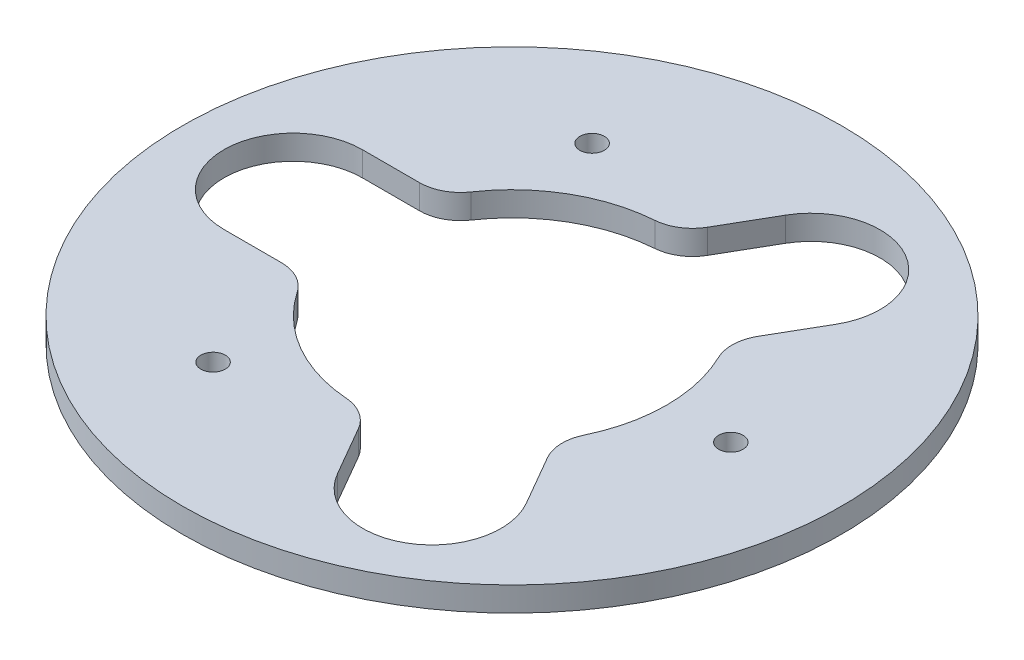
ISO-10303-21;
HEADER;
FILE_DESCRIPTION(('STEP AP214'),'2;1');
FILE_NAME('part.step','',(''),(''),'','','');
FILE_SCHEMA(('AUTOMOTIVE_DESIGN { 1 0 10303 214 1 1 1 1 }'));
ENDSEC;
DATA;
#1=APPLICATION_CONTEXT('core data for automotive mechanical design processes');
#2=APPLICATION_PROTOCOL_DEFINITION('international standard','automotive_design',2000,#1);
#3=PRODUCT_CONTEXT('',#1,'mechanical');
#4=PRODUCT('Part','Part','',(#3));
#5=PRODUCT_RELATED_PRODUCT_CATEGORY('part','',(#4));
#6=PRODUCT_DEFINITION_FORMATION('','',#4);
#7=PRODUCT_DEFINITION_CONTEXT('part definition',#1,'design');
#8=PRODUCT_DEFINITION('design','',#6,#7);
#9=PRODUCT_DEFINITION_SHAPE('','',#8);
#10=(LENGTH_UNIT() NAMED_UNIT(*) SI_UNIT(.MILLI.,.METRE.));
#11=(NAMED_UNIT(*) PLANE_ANGLE_UNIT() SI_UNIT($,.RADIAN.));
#12=(NAMED_UNIT(*) SI_UNIT($,.STERADIAN.) SOLID_ANGLE_UNIT());
#13=UNCERTAINTY_MEASURE_WITH_UNIT(LENGTH_MEASURE(1.E-05),#10,'distance_accuracy_value','');
#14=(GEOMETRIC_REPRESENTATION_CONTEXT(3) GLOBAL_UNCERTAINTY_ASSIGNED_CONTEXT((#13)) GLOBAL_UNIT_ASSIGNED_CONTEXT((#10,
#11,#12)) REPRESENTATION_CONTEXT('',''));
#15=CARTESIAN_POINT('',(0.,0.,0.));
#16=DIRECTION('',(0.,0.,1.));
#17=DIRECTION('',(1.,0.,0.));
#18=AXIS2_PLACEMENT_3D('',#15,#16,#17);
#19=CARTESIAN_POINT('',(0.,-3.,0.));
#20=DIRECTION('',(0.,1.,0.));
#21=DIRECTION('',(0.,0.,1.));
#22=AXIS2_PLACEMENT_3D('',#19,#20,#21);
#23=CYLINDRICAL_SURFACE('',#22,40.5);
#24=CARTESIAN_POINT('',(0.,-3.,0.));
#25=DIRECTION('',(0.,1.,0.));
#26=DIRECTION('',(0.,0.,1.));
#27=AXIS2_PLACEMENT_3D('',#24,#25,#26);
#28=CIRCLE('',#27,40.5);
#29=CARTESIAN_POINT('',(0.,-3.,40.5));
#30=VERTEX_POINT('',#29);
#31=EDGE_CURVE('E11',#30,#30,#28,.T.);
#32=ORIENTED_EDGE('',*,*,#31,.T.);
#33=EDGE_LOOP('',(#32));
#34=FACE_BOUND('',#33,.T.);
#35=CARTESIAN_POINT('',(0.,0.,0.));
#36=DIRECTION('',(0.,1.,0.));
#37=DIRECTION('',(0.,0.,1.));
#38=AXIS2_PLACEMENT_3D('',#35,#36,#37);
#39=CIRCLE('',#38,40.5);
#40=CARTESIAN_POINT('',(0.,0.,40.5));
#41=VERTEX_POINT('',#40);
#42=EDGE_CURVE('E50',#41,#41,#39,.T.);
#43=ORIENTED_EDGE('',*,*,#42,.F.);
#44=EDGE_LOOP('',(#43));
#45=FACE_BOUND('',#44,.T.);
#46=ADVANCED_FACE('F47',(#34,#45),#23,.T.);
#47=CARTESIAN_POINT('',(0.,-3.,0.));
#48=DIRECTION('',(0.,1.,0.));
#49=DIRECTION('',(0.,0.,1.));
#50=AXIS2_PLACEMENT_3D('',#47,#48,#49);
#51=PLANE('',#50);
#52=CARTESIAN_POINT('',(-13.4470587469807,-3.,23.2909888821045));
#53=DIRECTION('',(0.,1.,0.));
#54=DIRECTION('',(0.,0.,1.));
#55=AXIS2_PLACEMENT_3D('',#52,#53,#54);
#56=CIRCLE('',#55,1.5);
#57=CARTESIAN_POINT('',(-13.4470587469807,-3.,24.7909888821045));
#58=VERTEX_POINT('',#57);
#59=EDGE_CURVE('E618',#58,#58,#56,.T.);
#60=ORIENTED_EDGE('',*,*,#59,.T.);
#61=EDGE_LOOP('',(#60));
#62=FACE_BOUND('',#61,.T.);
#63=CARTESIAN_POINT('',(26.8941174246538,-3.,4.00146010076652E-08));
#64=DIRECTION('',(0.,1.,0.));
#65=DIRECTION('',(0.,0.,1.));
#66=AXIS2_PLACEMENT_3D('',#63,#64,#65);
#67=CIRCLE('',#66,1.5);
#68=CARTESIAN_POINT('',(26.8941174246538,-3.,1.5000000400146));
#69=VERTEX_POINT('',#68);
#70=EDGE_CURVE('E625',#69,#69,#67,.T.);
#71=ORIENTED_EDGE('',*,*,#70,.T.);
#72=EDGE_LOOP('',(#71));
#73=FACE_BOUND('',#72,.T.);
#74=CARTESIAN_POINT('',(-13.4470586776733,-3.,-23.2909889221191));
#75=DIRECTION('',(0.,1.,0.));
#76=DIRECTION('',(0.,0.,1.));
#77=AXIS2_PLACEMENT_3D('',#74,#75,#76);
#78=CIRCLE('',#77,1.5);
#79=CARTESIAN_POINT('',(-13.4470586776733,-3.,-21.7909889221191));
#80=VERTEX_POINT('',#79);
#81=EDGE_CURVE('E244',#80,#80,#78,.T.);
#82=ORIENTED_EDGE('',*,*,#81,.T.);
#83=EDGE_LOOP('',(#82));
#84=FACE_BOUND('',#83,.T.);
#85=DIRECTION('',(1.,0.,0.));
#86=VECTOR('',#85,1.);
#87=CARTESIAN_POINT('',(-26.8941192626953,-3.,8.5));
#88=LINE('',#87,#86);
#89=CARTESIAN_POINT('',(-26.8941192626953,-3.,8.5));
#90=VERTEX_POINT('',#89);
#91=CARTESIAN_POINT('',(-19.8431348329844,-3.,8.5));
#92=VERTEX_POINT('',#91);
#93=EDGE_CURVE('E179',#90,#92,#88,.T.);
#94=ORIENTED_EDGE('',*,*,#93,.T.);
#95=CARTESIAN_POINT('',(-19.8431348329844,-3.,13.5));
#96=DIRECTION('',(0.,-1.,0.));
#97=DIRECTION('',(0.,0.,-1.));
#98=AXIS2_PLACEMENT_3D('',#95,#96,#97);
#99=CIRCLE('',#98,5.);
#100=CARTESIAN_POINT('',(-15.7091484094462,-3.,10.6875000000001));
#101=VERTEX_POINT('',#100);
#102=EDGE_CURVE('E173',#92,#101,#99,.T.);
#103=ORIENTED_EDGE('',*,*,#102,.T.);
#104=CARTESIAN_POINT('',(0.,-3.,0.));
#105=DIRECTION('',(0.,1.,0.));
#106=DIRECTION('',(0.,0.,1.));
#107=AXIS2_PLACEMENT_3D('',#104,#105,#106);
#108=CIRCLE('',#107,19.0000000000002);
#109=CARTESIAN_POINT('',(-1.40107229822298,-3.,18.9482715944004));
#110=VERTEX_POINT('',#109);
#111=EDGE_CURVE('E182',#101,#110,#108,.T.);
#112=ORIENTED_EDGE('',*,*,#111,.T.);
#113=CARTESIAN_POINT('',(-1.76977553459748,-3.,23.9346588560848));
#114=DIRECTION('',(0.,-1.,0.));
#115=DIRECTION('',(0.,0.,1.));
#116=AXIS2_PLACEMENT_3D('',#113,#114,#115);
#117=CIRCLE('',#116,5.00000000000001);
#118=CARTESIAN_POINT('',(2.56035148432473,-3.,21.4346588560848));
#119=VERTEX_POINT('',#118);
#120=EDGE_CURVE('E61',#110,#119,#117,.T.);
#121=ORIENTED_EDGE('',*,*,#120,.T.);
#122=DIRECTION('',(0.5,0.,0.866025403784438));
#123=VECTOR('',#122,1.);
#124=CARTESIAN_POINT('',(6.08584369917995,-3.,27.5409904939026));
#125=LINE('',#124,#123);
#126=CARTESIAN_POINT('',(6.08584369917993,-3.,27.5409904939026));
#127=VERTEX_POINT('',#126);
#128=EDGE_CURVE('E200',#119,#127,#125,.T.);
#129=ORIENTED_EDGE('',*,*,#128,.T.);
#130=CARTESIAN_POINT('',(13.4470596313477,-3.,23.2909904939026));
#131=DIRECTION('',(0.,1.,0.));
#132=DIRECTION('',(0.,0.,1.));
#133=AXIS2_PLACEMENT_3D('',#130,#131,#132);
#134=CIRCLE('',#133,8.5);
#135=CARTESIAN_POINT('',(20.8082755635154,-3.,19.0409904939025));
#136=VERTEX_POINT('',#135);
#137=EDGE_CURVE('E203',#127,#136,#134,.T.);
#138=ORIENTED_EDGE('',*,*,#137,.T.);
#139=DIRECTION('',(-0.5,0.,-0.866025403784438));
#140=VECTOR('',#139,1.);
#141=CARTESIAN_POINT('',(20.8082755635154,-3.,19.0409904939025));
#142=LINE('',#141,#140);
#143=CARTESIAN_POINT('',(17.2827833486602,-3.,12.9346588560848));
#144=VERTEX_POINT('',#143);
#145=EDGE_CURVE('E206',#136,#144,#142,.T.);
#146=ORIENTED_EDGE('',*,*,#145,.T.);
#147=CARTESIAN_POINT('',(21.6129103675824,-3.,10.4346588560848));
#148=DIRECTION('',(0.,-1.,0.));
#149=DIRECTION('',(0.,0.,-1.));
#150=AXIS2_PLACEMENT_3D('',#147,#148,#149);
#151=CIRCLE('',#150,4.99999999999999);
#152=CARTESIAN_POINT('',(17.1102207076695,-3.,8.2607715944005));
#153=VERTEX_POINT('',#152);
#154=EDGE_CURVE('E209',#144,#153,#151,.T.);
#155=ORIENTED_EDGE('',*,*,#154,.T.);
#156=CARTESIAN_POINT('',(0.,-3.,0.));
#157=DIRECTION('',(0.,1.,0.));
#158=DIRECTION('',(0.,0.,1.));
#159=AXIS2_PLACEMENT_3D('',#156,#157,#158);
#160=CIRCLE('',#159,19.0000000000004);
#161=CARTESIAN_POINT('',(17.1102207076694,-3.,-8.26077159440052));
#162=VERTEX_POINT('',#161);
#163=EDGE_CURVE('E212',#153,#162,#160,.T.);
#164=ORIENTED_EDGE('',*,*,#163,.T.);
#165=CARTESIAN_POINT('',(21.6129103675824,-3.,-10.4346588560848));
#166=DIRECTION('',(0.,-1.,0.));
#167=DIRECTION('',(0.,0.,1.));
#168=AXIS2_PLACEMENT_3D('',#165,#166,#167);
#169=CIRCLE('',#168,5.);
#170=CARTESIAN_POINT('',(17.2827833486602,-3.,-12.9346588560848));
#171=VERTEX_POINT('',#170);
#172=EDGE_CURVE('E215',#162,#171,#169,.T.);
#173=ORIENTED_EDGE('',*,*,#172,.T.);
#174=DIRECTION('',(0.5,0.,-0.866025403784439));
#175=VECTOR('',#174,1.);
#176=CARTESIAN_POINT('',(20.8082755635154,-3.,-19.0409904939026));
#177=LINE('',#176,#175);
#178=CARTESIAN_POINT('',(20.8082755635154,-3.,-19.0409904939026));
#179=VERTEX_POINT('',#178);
#180=EDGE_CURVE('E218',#171,#179,#177,.T.);
#181=ORIENTED_EDGE('',*,*,#180,.T.);
#182=CARTESIAN_POINT('',(13.4470596313477,-3.,-23.2909904939026));
#183=DIRECTION('',(0.,1.,0.));
#184=DIRECTION('',(0.,0.,1.));
#185=AXIS2_PLACEMENT_3D('',#182,#183,#184);
#186=CIRCLE('',#185,8.5);
#187=CARTESIAN_POINT('',(6.08584369917992,-3.,-27.5409904939026));
#188=VERTEX_POINT('',#187);
#189=EDGE_CURVE('E221',#179,#188,#186,.T.);
#190=ORIENTED_EDGE('',*,*,#189,.T.);
#191=DIRECTION('',(-0.5,0.,0.866025403784439));
#192=VECTOR('',#191,1.);
#193=CARTESIAN_POINT('',(6.08584369917992,-3.,-27.5409904939026));
#194=LINE('',#193,#192);
#195=CARTESIAN_POINT('',(2.56035148432472,-3.,-21.4346588560848));
#196=VERTEX_POINT('',#195);
#197=EDGE_CURVE('E224',#188,#196,#194,.T.);
#198=ORIENTED_EDGE('',*,*,#197,.T.);
#199=CARTESIAN_POINT('',(-1.76977553459748,-3.,-23.9346588560848));
#200=DIRECTION('',(0.,-1.,0.));
#201=DIRECTION('',(0.,0.,-1.));
#202=AXIS2_PLACEMENT_3D('',#199,#200,#201);
#203=CIRCLE('',#202,5.);
#204=CARTESIAN_POINT('',(-1.40107229822299,-3.,-18.9482715944004));
#205=VERTEX_POINT('',#204);
#206=EDGE_CURVE('E227',#196,#205,#203,.T.);
#207=ORIENTED_EDGE('',*,*,#206,.T.);
#208=CARTESIAN_POINT('',(0.,-3.,0.));
#209=DIRECTION('',(0.,1.,0.));
#210=DIRECTION('',(0.,0.,1.));
#211=AXIS2_PLACEMENT_3D('',#208,#209,#210);
#212=CIRCLE('',#211,19.0000000000002);
#213=CARTESIAN_POINT('',(-15.709148409446,-3.,-10.6875));
#214=VERTEX_POINT('',#213);
#215=EDGE_CURVE('E230',#205,#214,#212,.T.);
#216=ORIENTED_EDGE('',*,*,#215,.T.);
#217=CARTESIAN_POINT('',(-19.8431348329844,-3.,-13.5));
#218=DIRECTION('',(0.,-1.,0.));
#219=DIRECTION('',(0.,0.,1.));
#220=AXIS2_PLACEMENT_3D('',#217,#218,#219);
#221=CIRCLE('',#220,5.);
#222=CARTESIAN_POINT('',(-19.8431348329844,-3.,-8.5));
#223=VERTEX_POINT('',#222);
#224=EDGE_CURVE('E233',#214,#223,#221,.T.);
#225=ORIENTED_EDGE('',*,*,#224,.T.);
#226=DIRECTION('',(-1.,0.,0.));
#227=VECTOR('',#226,1.);
#228=CARTESIAN_POINT('',(-26.8941192626953,-3.,-8.5));
#229=LINE('',#228,#227);
#230=CARTESIAN_POINT('',(-26.8941192626953,-3.,-8.5));
#231=VERTEX_POINT('',#230);
#232=EDGE_CURVE('E236',#223,#231,#229,.T.);
#233=ORIENTED_EDGE('',*,*,#232,.T.);
#234=CARTESIAN_POINT('',(-26.8941192626953,-3.,0.));
#235=DIRECTION('',(0.,1.,0.));
#236=DIRECTION('',(0.,0.,1.));
#237=AXIS2_PLACEMENT_3D('',#234,#235,#236);
#238=CIRCLE('',#237,8.5);
#239=EDGE_CURVE('E239',#231,#90,#238,.T.);
#240=ORIENTED_EDGE('',*,*,#239,.T.);
#241=EDGE_LOOP('',(#94,#103,#112,#121,#129,#138,#146,#155,#164,#173,#181,#190,#198,#207,#216,
#225,#233,#240));
#242=FACE_BOUND('',#241,.T.);
#243=ORIENTED_EDGE('',*,*,#31,.F.);
#244=EDGE_LOOP('',(#243));
#245=FACE_BOUND('',#244,.T.);
#246=ADVANCED_FACE('F186',(#62,#73,#84,#242,#245),#51,.F.);
#247=CARTESIAN_POINT('',(0.,0.,0.));
#248=DIRECTION('',(0.,1.,0.));
#249=DIRECTION('',(0.,0.,1.));
#250=AXIS2_PLACEMENT_3D('',#247,#248,#249);
#251=PLANE('',#250);
#252=CARTESIAN_POINT('',(-13.4470587469807,0.,23.2909888821045));
#253=DIRECTION('',(0.,1.,0.));
#254=DIRECTION('',(0.,0.,1.));
#255=AXIS2_PLACEMENT_3D('',#252,#253,#254);
#256=CIRCLE('',#255,1.5);
#257=CARTESIAN_POINT('',(-13.4470587469807,0.,24.7909888821045));
#258=VERTEX_POINT('',#257);
#259=EDGE_CURVE('E620',#258,#258,#256,.T.);
#260=ORIENTED_EDGE('',*,*,#259,.F.);
#261=EDGE_LOOP('',(#260));
#262=FACE_BOUND('',#261,.T.);
#263=CARTESIAN_POINT('',(26.8941174246538,0.,4.00146010076652E-08));
#264=DIRECTION('',(0.,1.,0.));
#265=DIRECTION('',(0.,0.,1.));
#266=AXIS2_PLACEMENT_3D('',#263,#264,#265);
#267=CIRCLE('',#266,1.5);
#268=CARTESIAN_POINT('',(26.8941174246538,0.,1.5000000400146));
#269=VERTEX_POINT('',#268);
#270=EDGE_CURVE('E622',#269,#269,#267,.T.);
#271=ORIENTED_EDGE('',*,*,#270,.F.);
#272=EDGE_LOOP('',(#271));
#273=FACE_BOUND('',#272,.T.);
#274=CARTESIAN_POINT('',(-13.4470586776733,0.,-23.2909889221191));
#275=DIRECTION('',(0.,1.,0.));
#276=DIRECTION('',(0.,0.,1.));
#277=AXIS2_PLACEMENT_3D('',#274,#275,#276);
#278=CIRCLE('',#277,1.5);
#279=CARTESIAN_POINT('',(-13.4470586776733,0.,-21.7909889221191));
#280=VERTEX_POINT('',#279);
#281=EDGE_CURVE('E196',#280,#280,#278,.T.);
#282=ORIENTED_EDGE('',*,*,#281,.F.);
#283=EDGE_LOOP('',(#282));
#284=FACE_BOUND('',#283,.T.);
#285=CARTESIAN_POINT('',(-19.8431348329844,0.,13.5));
#286=DIRECTION('',(0.,-1.,0.));
#287=DIRECTION('',(0.,0.,-1.));
#288=AXIS2_PLACEMENT_3D('',#285,#286,#287);
#289=CIRCLE('',#288,5.);
#290=CARTESIAN_POINT('',(-19.8431348329844,0.,8.5));
#291=VERTEX_POINT('',#290);
#292=CARTESIAN_POINT('',(-15.7091484094462,0.,10.6875000000001));
#293=VERTEX_POINT('',#292);
#294=EDGE_CURVE('E69',#291,#293,#289,.T.);
#295=ORIENTED_EDGE('',*,*,#294,.F.);
#296=DIRECTION('',(1.,0.,0.));
#297=VECTOR('',#296,1.);
#298=CARTESIAN_POINT('',(-26.8941192626953,0.,8.5));
#299=LINE('',#298,#297);
#300=CARTESIAN_POINT('',(-26.8941192626953,0.,8.5));
#301=VERTEX_POINT('',#300);
#302=EDGE_CURVE('E190',#301,#291,#299,.T.);
#303=ORIENTED_EDGE('',*,*,#302,.F.);
#304=CARTESIAN_POINT('',(-26.8941192626953,0.,0.));
#305=DIRECTION('',(0.,1.,0.));
#306=DIRECTION('',(0.,0.,1.));
#307=AXIS2_PLACEMENT_3D('',#304,#305,#306);
#308=CIRCLE('',#307,8.5);
#309=CARTESIAN_POINT('',(-26.8941192626953,0.,-8.5));
#310=VERTEX_POINT('',#309);
#311=EDGE_CURVE('E193',#310,#301,#308,.T.);
#312=ORIENTED_EDGE('',*,*,#311,.F.);
#313=DIRECTION('',(-1.,0.,0.));
#314=VECTOR('',#313,1.);
#315=CARTESIAN_POINT('',(-26.8941192626953,0.,-8.5));
#316=LINE('',#315,#314);
#317=CARTESIAN_POINT('',(-19.8431348329844,0.,-8.5));
#318=VERTEX_POINT('',#317);
#319=EDGE_CURVE('E285',#318,#310,#316,.T.);
#320=ORIENTED_EDGE('',*,*,#319,.F.);
#321=CARTESIAN_POINT('',(-19.8431348329844,0.,-13.5));
#322=DIRECTION('',(0.,-1.,0.));
#323=DIRECTION('',(0.,0.,1.));
#324=AXIS2_PLACEMENT_3D('',#321,#322,#323);
#325=CIRCLE('',#324,5.);
#326=CARTESIAN_POINT('',(-15.709148409446,0.,-10.6875));
#327=VERTEX_POINT('',#326);
#328=EDGE_CURVE('E282',#327,#318,#325,.T.);
#329=ORIENTED_EDGE('',*,*,#328,.F.);
#330=CARTESIAN_POINT('',(0.,0.,0.));
#331=DIRECTION('',(0.,1.,0.));
#332=DIRECTION('',(0.,0.,1.));
#333=AXIS2_PLACEMENT_3D('',#330,#331,#332);
#334=CIRCLE('',#333,19.0000000000002);
#335=CARTESIAN_POINT('',(-1.40107229822299,0.,-18.9482715944004));
#336=VERTEX_POINT('',#335);
#337=EDGE_CURVE('E279',#336,#327,#334,.T.);
#338=ORIENTED_EDGE('',*,*,#337,.F.);
#339=CARTESIAN_POINT('',(-1.76977553459748,0.,-23.9346588560848));
#340=DIRECTION('',(0.,-1.,0.));
#341=DIRECTION('',(0.,0.,-1.));
#342=AXIS2_PLACEMENT_3D('',#339,#340,#341);
#343=CIRCLE('',#342,5.);
#344=CARTESIAN_POINT('',(2.56035148432472,0.,-21.4346588560848));
#345=VERTEX_POINT('',#344);
#346=EDGE_CURVE('E276',#345,#336,#343,.T.);
#347=ORIENTED_EDGE('',*,*,#346,.F.);
#348=DIRECTION('',(-0.5,0.,0.866025403784439));
#349=VECTOR('',#348,1.);
#350=CARTESIAN_POINT('',(6.08584369917992,0.,-27.5409904939026));
#351=LINE('',#350,#349);
#352=CARTESIAN_POINT('',(6.08584369917992,0.,-27.5409904939026));
#353=VERTEX_POINT('',#352);
#354=EDGE_CURVE('E273',#353,#345,#351,.T.);
#355=ORIENTED_EDGE('',*,*,#354,.F.);
#356=CARTESIAN_POINT('',(13.4470596313477,0.,-23.2909904939026));
#357=DIRECTION('',(0.,1.,0.));
#358=DIRECTION('',(0.,0.,1.));
#359=AXIS2_PLACEMENT_3D('',#356,#357,#358);
#360=CIRCLE('',#359,8.5);
#361=CARTESIAN_POINT('',(20.8082755635154,0.,-19.0409904939026));
#362=VERTEX_POINT('',#361);
#363=EDGE_CURVE('E270',#362,#353,#360,.T.);
#364=ORIENTED_EDGE('',*,*,#363,.F.);
#365=DIRECTION('',(0.5,0.,-0.866025403784439));
#366=VECTOR('',#365,1.);
#367=CARTESIAN_POINT('',(20.8082755635154,0.,-19.0409904939026));
#368=LINE('',#367,#366);
#369=CARTESIAN_POINT('',(17.2827833486602,0.,-12.9346588560848));
#370=VERTEX_POINT('',#369);
#371=EDGE_CURVE('E267',#370,#362,#368,.T.);
#372=ORIENTED_EDGE('',*,*,#371,.F.);
#373=CARTESIAN_POINT('',(21.6129103675824,0.,-10.4346588560848));
#374=DIRECTION('',(0.,-1.,0.));
#375=DIRECTION('',(0.,0.,1.));
#376=AXIS2_PLACEMENT_3D('',#373,#374,#375);
#377=CIRCLE('',#376,5.);
#378=CARTESIAN_POINT('',(17.1102207076694,0.,-8.26077159440052));
#379=VERTEX_POINT('',#378);
#380=EDGE_CURVE('E264',#379,#370,#377,.T.);
#381=ORIENTED_EDGE('',*,*,#380,.F.);
#382=CARTESIAN_POINT('',(0.,0.,0.));
#383=DIRECTION('',(0.,1.,0.));
#384=DIRECTION('',(0.,0.,1.));
#385=AXIS2_PLACEMENT_3D('',#382,#383,#384);
#386=CIRCLE('',#385,19.0000000000004);
#387=CARTESIAN_POINT('',(17.1102207076695,0.,8.2607715944005));
#388=VERTEX_POINT('',#387);
#389=EDGE_CURVE('E261',#388,#379,#386,.T.);
#390=ORIENTED_EDGE('',*,*,#389,.F.);
#391=CARTESIAN_POINT('',(21.6129103675824,0.,10.4346588560848));
#392=DIRECTION('',(0.,-1.,0.));
#393=DIRECTION('',(0.,0.,-1.));
#394=AXIS2_PLACEMENT_3D('',#391,#392,#393);
#395=CIRCLE('',#394,4.99999999999999);
#396=CARTESIAN_POINT('',(17.2827833486602,0.,12.9346588560848));
#397=VERTEX_POINT('',#396);
#398=EDGE_CURVE('E258',#397,#388,#395,.T.);
#399=ORIENTED_EDGE('',*,*,#398,.F.);
#400=DIRECTION('',(-0.5,0.,-0.866025403784438));
#401=VECTOR('',#400,1.);
#402=CARTESIAN_POINT('',(20.8082755635154,0.,19.0409904939025));
#403=LINE('',#402,#401);
#404=CARTESIAN_POINT('',(20.8082755635154,0.,19.0409904939025));
#405=VERTEX_POINT('',#404);
#406=EDGE_CURVE('E255',#405,#397,#403,.T.);
#407=ORIENTED_EDGE('',*,*,#406,.F.);
#408=CARTESIAN_POINT('',(13.4470596313477,0.,23.2909904939026));
#409=DIRECTION('',(0.,1.,0.));
#410=DIRECTION('',(0.,0.,1.));
#411=AXIS2_PLACEMENT_3D('',#408,#409,#410);
#412=CIRCLE('',#411,8.5);
#413=CARTESIAN_POINT('',(6.08584369917993,0.,27.5409904939026));
#414=VERTEX_POINT('',#413);
#415=EDGE_CURVE('E252',#414,#405,#412,.T.);
#416=ORIENTED_EDGE('',*,*,#415,.F.);
#417=DIRECTION('',(0.5,0.,0.866025403784438));
#418=VECTOR('',#417,1.);
#419=CARTESIAN_POINT('',(6.08584369917995,0.,27.5409904939026));
#420=LINE('',#419,#418);
#421=CARTESIAN_POINT('',(2.56035148432473,0.,21.4346588560848));
#422=VERTEX_POINT('',#421);
#423=EDGE_CURVE('E249',#422,#414,#420,.T.);
#424=ORIENTED_EDGE('',*,*,#423,.F.);
#425=CARTESIAN_POINT('',(-1.76977553459748,0.,23.9346588560848));
#426=DIRECTION('',(0.,-1.,0.));
#427=DIRECTION('',(0.,0.,1.));
#428=AXIS2_PLACEMENT_3D('',#425,#426,#427);
#429=CIRCLE('',#428,5.00000000000001);
#430=CARTESIAN_POINT('',(-1.40107229822299,0.,18.9482715944005));
#431=VERTEX_POINT('',#430);
#432=EDGE_CURVE('E246',#431,#422,#429,.T.);
#433=ORIENTED_EDGE('',*,*,#432,.F.);
#434=CARTESIAN_POINT('',(0.,0.,0.));
#435=DIRECTION('',(0.,1.,0.));
#436=DIRECTION('',(0.,0.,1.));
#437=AXIS2_PLACEMENT_3D('',#434,#435,#436);
#438=CIRCLE('',#437,19.0000000000002);
#439=EDGE_CURVE('E243',#293,#431,#438,.T.);
#440=ORIENTED_EDGE('',*,*,#439,.F.);
#441=EDGE_LOOP('',(#295,#303,#312,#320,#329,#338,#347,#355,#364,#372,#381,#390,#399,#407,#416,
#424,#433,#440));
#442=FACE_BOUND('',#441,.T.);
#443=ORIENTED_EDGE('',*,*,#42,.T.);
#444=EDGE_LOOP('',(#443));
#445=FACE_BOUND('',#444,.T.);
#446=ADVANCED_FACE('F326',(#262,#273,#284,#442,#445),#251,.T.);
#447=CARTESIAN_POINT('',(-19.8431348329844,-3.,13.5));
#448=DIRECTION('',(0.,1.,0.));
#449=DIRECTION('',(0.,0.,1.));
#450=AXIS2_PLACEMENT_3D('',#447,#448,#449);
#451=CYLINDRICAL_SURFACE('',#450,5.);
#452=ORIENTED_EDGE('',*,*,#294,.T.);
#453=DIRECTION('',(0.,1.,0.));
#454=VECTOR('',#453,1.);
#455=CARTESIAN_POINT('',(-15.7091484094462,-3.,10.6875000000001));
#456=LINE('',#455,#454);
#457=EDGE_CURVE('E169',#101,#293,#456,.T.);
#458=ORIENTED_EDGE('',*,*,#457,.F.);
#459=ORIENTED_EDGE('',*,*,#102,.F.);
#460=DIRECTION('',(0.,1.,0.));
#461=VECTOR('',#460,1.);
#462=CARTESIAN_POINT('',(-19.8431348329844,-3.,8.5));
#463=LINE('',#462,#461);
#464=EDGE_CURVE('E290',#92,#291,#463,.T.);
#465=ORIENTED_EDGE('',*,*,#464,.T.);
#466=EDGE_LOOP('',(#452,#458,#459,#465));
#467=FACE_BOUND('',#466,.T.);
#468=ADVANCED_FACE('F171',(#467),#451,.T.);
#469=CARTESIAN_POINT('',(-26.8941192626953,-3.,8.5));
#470=DIRECTION('',(0.,0.,1.));
#471=DIRECTION('',(1.,0.,0.));
#472=AXIS2_PLACEMENT_3D('',#469,#470,#471);
#473=PLANE('',#472);
#474=ORIENTED_EDGE('',*,*,#302,.T.);
#475=ORIENTED_EDGE('',*,*,#464,.F.);
#476=ORIENTED_EDGE('',*,*,#93,.F.);
#477=DIRECTION('',(0.,1.,0.));
#478=VECTOR('',#477,1.);
#479=CARTESIAN_POINT('',(-26.8941192626953,-3.,8.5));
#480=LINE('',#479,#478);
#481=EDGE_CURVE('E292',#90,#301,#480,.T.);
#482=ORIENTED_EDGE('',*,*,#481,.T.);
#483=EDGE_LOOP('',(#474,#475,#476,#482));
#484=FACE_BOUND('',#483,.T.);
#485=ADVANCED_FACE('F385',(#484),#473,.F.);
#486=CARTESIAN_POINT('',(-26.8941192626953,-3.,0.));
#487=DIRECTION('',(0.,1.,0.));
#488=DIRECTION('',(0.,0.,1.));
#489=AXIS2_PLACEMENT_3D('',#486,#487,#488);
#490=CYLINDRICAL_SURFACE('',#489,8.5);
#491=ORIENTED_EDGE('',*,*,#311,.T.);
#492=ORIENTED_EDGE('',*,*,#481,.F.);
#493=ORIENTED_EDGE('',*,*,#239,.F.);
#494=DIRECTION('',(0.,1.,0.));
#495=VECTOR('',#494,1.);
#496=CARTESIAN_POINT('',(-26.8941192626953,-3.,-8.5));
#497=LINE('',#496,#495);
#498=EDGE_CURVE('E294',#231,#310,#497,.T.);
#499=ORIENTED_EDGE('',*,*,#498,.T.);
#500=EDGE_LOOP('',(#491,#492,#493,#499));
#501=FACE_BOUND('',#500,.T.);
#502=ADVANCED_FACE('F381',(#501),#490,.F.);
#503=CARTESIAN_POINT('',(-26.8941192626953,-3.,-8.5));
#504=DIRECTION('',(0.,0.,-1.));
#505=DIRECTION('',(-1.,0.,0.));
#506=AXIS2_PLACEMENT_3D('',#503,#504,#505);
#507=PLANE('',#506);
#508=ORIENTED_EDGE('',*,*,#319,.T.);
#509=ORIENTED_EDGE('',*,*,#498,.F.);
#510=ORIENTED_EDGE('',*,*,#232,.F.);
#511=DIRECTION('',(0.,1.,0.));
#512=VECTOR('',#511,1.);
#513=CARTESIAN_POINT('',(-19.8431348329844,-3.,-8.5));
#514=LINE('',#513,#512);
#515=EDGE_CURVE('E296',#223,#318,#514,.T.);
#516=ORIENTED_EDGE('',*,*,#515,.T.);
#517=EDGE_LOOP('',(#508,#509,#510,#516));
#518=FACE_BOUND('',#517,.T.);
#519=ADVANCED_FACE('F378',(#518),#507,.F.);
#520=CARTESIAN_POINT('',(-19.8431348329844,-3.,-13.5));
#521=DIRECTION('',(0.,1.,0.));
#522=DIRECTION('',(0.,0.,1.));
#523=AXIS2_PLACEMENT_3D('',#520,#521,#522);
#524=CYLINDRICAL_SURFACE('',#523,5.);
#525=ORIENTED_EDGE('',*,*,#328,.T.);
#526=ORIENTED_EDGE('',*,*,#515,.F.);
#527=ORIENTED_EDGE('',*,*,#224,.F.);
#528=DIRECTION('',(0.,1.,0.));
#529=VECTOR('',#528,1.);
#530=CARTESIAN_POINT('',(-15.709148409446,-3.,-10.6875));
#531=LINE('',#530,#529);
#532=EDGE_CURVE('E298',#214,#327,#531,.T.);
#533=ORIENTED_EDGE('',*,*,#532,.T.);
#534=EDGE_LOOP('',(#525,#526,#527,#533));
#535=FACE_BOUND('',#534,.T.);
#536=ADVANCED_FACE('F374',(#535),#524,.T.);
#537=CARTESIAN_POINT('',(0.,-3.,0.));
#538=DIRECTION('',(0.,1.,0.));
#539=DIRECTION('',(0.,0.,1.));
#540=AXIS2_PLACEMENT_3D('',#537,#538,#539);
#541=CYLINDRICAL_SURFACE('',#540,19.0000000000002);
#542=ORIENTED_EDGE('',*,*,#337,.T.);
#543=ORIENTED_EDGE('',*,*,#532,.F.);
#544=ORIENTED_EDGE('',*,*,#215,.F.);
#545=DIRECTION('',(0.,1.,0.));
#546=VECTOR('',#545,1.);
#547=CARTESIAN_POINT('',(-1.40107229822299,-3.,-18.9482715944004));
#548=LINE('',#547,#546);
#549=EDGE_CURVE('E300',#205,#336,#548,.T.);
#550=ORIENTED_EDGE('',*,*,#549,.T.);
#551=EDGE_LOOP('',(#542,#543,#544,#550));
#552=FACE_BOUND('',#551,.T.);
#553=ADVANCED_FACE('F370',(#552),#541,.F.);
#554=CARTESIAN_POINT('',(-1.76977553459748,-3.,-23.9346588560848));
#555=DIRECTION('',(0.,1.,0.));
#556=DIRECTION('',(0.,0.,1.));
#557=AXIS2_PLACEMENT_3D('',#554,#555,#556);
#558=CYLINDRICAL_SURFACE('',#557,5.);
#559=ORIENTED_EDGE('',*,*,#346,.T.);
#560=ORIENTED_EDGE('',*,*,#549,.F.);
#561=ORIENTED_EDGE('',*,*,#206,.F.);
#562=DIRECTION('',(0.,1.,0.));
#563=VECTOR('',#562,1.);
#564=CARTESIAN_POINT('',(2.56035148432472,-3.,-21.4346588560848));
#565=LINE('',#564,#563);
#566=EDGE_CURVE('E302',#196,#345,#565,.T.);
#567=ORIENTED_EDGE('',*,*,#566,.T.);
#568=EDGE_LOOP('',(#559,#560,#561,#567));
#569=FACE_BOUND('',#568,.T.);
#570=ADVANCED_FACE('F366',(#569),#558,.T.);
#571=CARTESIAN_POINT('',(6.08584369917992,-3.,-27.5409904939026));
#572=DIRECTION('',(-0.866025403784439,0.,-0.5));
#573=DIRECTION('',(-0.5,0.,0.866025403784439));
#574=AXIS2_PLACEMENT_3D('',#571,#572,#573);
#575=PLANE('',#574);
#576=ORIENTED_EDGE('',*,*,#354,.T.);
#577=ORIENTED_EDGE('',*,*,#566,.F.);
#578=ORIENTED_EDGE('',*,*,#197,.F.);
#579=DIRECTION('',(0.,1.,0.));
#580=VECTOR('',#579,1.);
#581=CARTESIAN_POINT('',(6.08584369917992,-3.,-27.5409904939026));
#582=LINE('',#581,#580);
#583=EDGE_CURVE('E304',#188,#353,#582,.T.);
#584=ORIENTED_EDGE('',*,*,#583,.T.);
#585=EDGE_LOOP('',(#576,#577,#578,#584));
#586=FACE_BOUND('',#585,.T.);
#587=ADVANCED_FACE('F362',(#586),#575,.F.);
#588=CARTESIAN_POINT('',(13.4470596313477,-3.,-23.2909904939026));
#589=DIRECTION('',(0.,1.,0.));
#590=DIRECTION('',(0.,0.,1.));
#591=AXIS2_PLACEMENT_3D('',#588,#589,#590);
#592=CYLINDRICAL_SURFACE('',#591,8.5);
#593=ORIENTED_EDGE('',*,*,#363,.T.);
#594=ORIENTED_EDGE('',*,*,#583,.F.);
#595=ORIENTED_EDGE('',*,*,#189,.F.);
#596=DIRECTION('',(0.,1.,0.));
#597=VECTOR('',#596,1.);
#598=CARTESIAN_POINT('',(20.8082755635154,-3.,-19.0409904939026));
#599=LINE('',#598,#597);
#600=EDGE_CURVE('E306',#179,#362,#599,.T.);
#601=ORIENTED_EDGE('',*,*,#600,.T.);
#602=EDGE_LOOP('',(#593,#594,#595,#601));
#603=FACE_BOUND('',#602,.T.);
#604=ADVANCED_FACE('F358',(#603),#592,.F.);
#605=CARTESIAN_POINT('',(20.8082755635154,-3.,-19.0409904939026));
#606=DIRECTION('',(0.866025403784439,0.,0.5));
#607=DIRECTION('',(0.5,0.,-0.866025403784439));
#608=AXIS2_PLACEMENT_3D('',#605,#606,#607);
#609=PLANE('',#608);
#610=ORIENTED_EDGE('',*,*,#371,.T.);
#611=ORIENTED_EDGE('',*,*,#600,.F.);
#612=ORIENTED_EDGE('',*,*,#180,.F.);
#613=DIRECTION('',(0.,1.,0.));
#614=VECTOR('',#613,1.);
#615=CARTESIAN_POINT('',(17.2827833486602,-3.,-12.9346588560848));
#616=LINE('',#615,#614);
#617=EDGE_CURVE('E308',#171,#370,#616,.T.);
#618=ORIENTED_EDGE('',*,*,#617,.T.);
#619=EDGE_LOOP('',(#610,#611,#612,#618));
#620=FACE_BOUND('',#619,.T.);
#621=ADVANCED_FACE('F354',(#620),#609,.F.);
#622=CARTESIAN_POINT('',(21.6129103675824,-3.,-10.4346588560848));
#623=DIRECTION('',(0.,1.,0.));
#624=DIRECTION('',(0.,0.,1.));
#625=AXIS2_PLACEMENT_3D('',#622,#623,#624);
#626=CYLINDRICAL_SURFACE('',#625,5.);
#627=ORIENTED_EDGE('',*,*,#380,.T.);
#628=ORIENTED_EDGE('',*,*,#617,.F.);
#629=ORIENTED_EDGE('',*,*,#172,.F.);
#630=DIRECTION('',(0.,1.,0.));
#631=VECTOR('',#630,1.);
#632=CARTESIAN_POINT('',(17.1102207076694,-3.,-8.26077159440052));
#633=LINE('',#632,#631);
#634=EDGE_CURVE('E310',#162,#379,#633,.T.);
#635=ORIENTED_EDGE('',*,*,#634,.T.);
#636=EDGE_LOOP('',(#627,#628,#629,#635));
#637=FACE_BOUND('',#636,.T.);
#638=ADVANCED_FACE('F350',(#637),#626,.T.);
#639=CARTESIAN_POINT('',(0.,-3.,0.));
#640=DIRECTION('',(0.,1.,0.));
#641=DIRECTION('',(0.,0.,1.));
#642=AXIS2_PLACEMENT_3D('',#639,#640,#641);
#643=CYLINDRICAL_SURFACE('',#642,19.0000000000004);
#644=ORIENTED_EDGE('',*,*,#389,.T.);
#645=ORIENTED_EDGE('',*,*,#634,.F.);
#646=ORIENTED_EDGE('',*,*,#163,.F.);
#647=DIRECTION('',(0.,1.,0.));
#648=VECTOR('',#647,1.);
#649=CARTESIAN_POINT('',(17.1102207076695,-3.,8.2607715944005));
#650=LINE('',#649,#648);
#651=EDGE_CURVE('E312',#153,#388,#650,.T.);
#652=ORIENTED_EDGE('',*,*,#651,.T.);
#653=EDGE_LOOP('',(#644,#645,#646,#652));
#654=FACE_BOUND('',#653,.T.);
#655=ADVANCED_FACE('F346',(#654),#643,.F.);
#656=CARTESIAN_POINT('',(21.6129103675824,-3.,10.4346588560848));
#657=DIRECTION('',(0.,1.,0.));
#658=DIRECTION('',(0.,0.,1.));
#659=AXIS2_PLACEMENT_3D('',#656,#657,#658);
#660=CYLINDRICAL_SURFACE('',#659,4.99999999999999);
#661=ORIENTED_EDGE('',*,*,#398,.T.);
#662=ORIENTED_EDGE('',*,*,#651,.F.);
#663=ORIENTED_EDGE('',*,*,#154,.F.);
#664=DIRECTION('',(0.,1.,0.));
#665=VECTOR('',#664,1.);
#666=CARTESIAN_POINT('',(17.2827833486602,-3.,12.9346588560848));
#667=LINE('',#666,#665);
#668=EDGE_CURVE('E314',#144,#397,#667,.T.);
#669=ORIENTED_EDGE('',*,*,#668,.T.);
#670=EDGE_LOOP('',(#661,#662,#663,#669));
#671=FACE_BOUND('',#670,.T.);
#672=ADVANCED_FACE('F342',(#671),#660,.T.);
#673=CARTESIAN_POINT('',(20.8082755635154,-3.,19.0409904939025));
#674=DIRECTION('',(0.866025403784438,0.,-0.5));
#675=DIRECTION('',(-0.5,0.,-0.866025403784438));
#676=AXIS2_PLACEMENT_3D('',#673,#674,#675);
#677=PLANE('',#676);
#678=ORIENTED_EDGE('',*,*,#406,.T.);
#679=ORIENTED_EDGE('',*,*,#668,.F.);
#680=ORIENTED_EDGE('',*,*,#145,.F.);
#681=DIRECTION('',(0.,1.,0.));
#682=VECTOR('',#681,1.);
#683=CARTESIAN_POINT('',(20.8082755635154,-3.,19.0409904939025));
#684=LINE('',#683,#682);
#685=EDGE_CURVE('E316',#136,#405,#684,.T.);
#686=ORIENTED_EDGE('',*,*,#685,.T.);
#687=EDGE_LOOP('',(#678,#679,#680,#686));
#688=FACE_BOUND('',#687,.T.);
#689=ADVANCED_FACE('F338',(#688),#677,.F.);
#690=CARTESIAN_POINT('',(13.4470596313477,-3.,23.2909904939026));
#691=DIRECTION('',(0.,1.,0.));
#692=DIRECTION('',(0.,0.,1.));
#693=AXIS2_PLACEMENT_3D('',#690,#691,#692);
#694=CYLINDRICAL_SURFACE('',#693,8.5);
#695=ORIENTED_EDGE('',*,*,#415,.T.);
#696=ORIENTED_EDGE('',*,*,#685,.F.);
#697=ORIENTED_EDGE('',*,*,#137,.F.);
#698=DIRECTION('',(0.,1.,0.));
#699=VECTOR('',#698,1.);
#700=CARTESIAN_POINT('',(6.08584369917993,-3.,27.5409904939026));
#701=LINE('',#700,#699);
#702=EDGE_CURVE('E318',#127,#414,#701,.T.);
#703=ORIENTED_EDGE('',*,*,#702,.T.);
#704=EDGE_LOOP('',(#695,#696,#697,#703));
#705=FACE_BOUND('',#704,.T.);
#706=ADVANCED_FACE('F336',(#705),#694,.F.);
#707=CARTESIAN_POINT('',(6.08584369917995,-3.,27.5409904939026));
#708=DIRECTION('',(-0.866025403784438,0.,0.5));
#709=DIRECTION('',(0.5,0.,0.866025403784438));
#710=AXIS2_PLACEMENT_3D('',#707,#708,#709);
#711=PLANE('',#710);
#712=ORIENTED_EDGE('',*,*,#423,.T.);
#713=ORIENTED_EDGE('',*,*,#702,.F.);
#714=ORIENTED_EDGE('',*,*,#128,.F.);
#715=DIRECTION('',(0.,1.,0.));
#716=VECTOR('',#715,1.);
#717=CARTESIAN_POINT('',(2.56035148432473,-3.,21.4346588560848));
#718=LINE('',#717,#716);
#719=EDGE_CURVE('E320',#119,#422,#718,.T.);
#720=ORIENTED_EDGE('',*,*,#719,.T.);
#721=EDGE_LOOP('',(#712,#713,#714,#720));
#722=FACE_BOUND('',#721,.T.);
#723=ADVANCED_FACE('F331',(#722),#711,.F.);
#724=CARTESIAN_POINT('',(-1.76977553459748,-3.,23.9346588560848));
#725=DIRECTION('',(0.,1.,0.));
#726=DIRECTION('',(0.,0.,1.));
#727=AXIS2_PLACEMENT_3D('',#724,#725,#726);
#728=CYLINDRICAL_SURFACE('',#727,5.00000000000001);
#729=ORIENTED_EDGE('',*,*,#432,.T.);
#730=ORIENTED_EDGE('',*,*,#719,.F.);
#731=ORIENTED_EDGE('',*,*,#120,.F.);
#732=DIRECTION('',(0.,1.,0.));
#733=VECTOR('',#732,1.);
#734=CARTESIAN_POINT('',(-1.40107229822299,-3.,18.9482715944005));
#735=LINE('',#734,#733);
#736=EDGE_CURVE('E178',#110,#431,#735,.T.);
#737=ORIENTED_EDGE('',*,*,#736,.T.);
#738=EDGE_LOOP('',(#729,#730,#731,#737));
#739=FACE_BOUND('',#738,.T.);
#740=ADVANCED_FACE('F322',(#739),#728,.T.);
#741=CARTESIAN_POINT('',(0.,-3.,0.));
#742=DIRECTION('',(0.,1.,0.));
#743=DIRECTION('',(0.,0.,1.));
#744=AXIS2_PLACEMENT_3D('',#741,#742,#743);
#745=CYLINDRICAL_SURFACE('',#744,19.0000000000002);
#746=ORIENTED_EDGE('',*,*,#439,.T.);
#747=ORIENTED_EDGE('',*,*,#736,.F.);
#748=ORIENTED_EDGE('',*,*,#111,.F.);
#749=ORIENTED_EDGE('',*,*,#457,.T.);
#750=EDGE_LOOP('',(#746,#747,#748,#749));
#751=FACE_BOUND('',#750,.T.);
#752=ADVANCED_FACE('F183',(#751),#745,.F.);
#753=CARTESIAN_POINT('',(-13.4470586776733,-3.,-23.2909889221191));
#754=DIRECTION('',(0.,1.,0.));
#755=DIRECTION('',(0.,0.,1.));
#756=AXIS2_PLACEMENT_3D('',#753,#754,#755);
#757=CYLINDRICAL_SURFACE('',#756,1.5);
#758=ORIENTED_EDGE('',*,*,#81,.F.);
#759=EDGE_LOOP('',(#758));
#760=FACE_BOUND('',#759,.T.);
#761=ORIENTED_EDGE('',*,*,#281,.T.);
#762=EDGE_LOOP('',(#761));
#763=FACE_BOUND('',#762,.T.);
#764=ADVANCED_FACE('F415',(#760,#763),#757,.F.);
#765=CARTESIAN_POINT('',(26.8941174246538,-3.,4.00146010076652E-08));
#766=DIRECTION('',(0.,1.,0.));
#767=DIRECTION('',(0.,0.,1.));
#768=AXIS2_PLACEMENT_3D('',#765,#766,#767);
#769=CYLINDRICAL_SURFACE('',#768,1.5);
#770=ORIENTED_EDGE('',*,*,#70,.F.);
#771=EDGE_LOOP('',(#770));
#772=FACE_BOUND('',#771,.T.);
#773=ORIENTED_EDGE('',*,*,#270,.T.);
#774=EDGE_LOOP('',(#773));
#775=FACE_BOUND('',#774,.T.);
#776=ADVANCED_FACE('F524',(#772,#775),#769,.F.);
#777=CARTESIAN_POINT('',(-13.4470587469807,-3.,23.2909888821045));
#778=DIRECTION('',(0.,1.,0.));
#779=DIRECTION('',(0.,0.,1.));
#780=AXIS2_PLACEMENT_3D('',#777,#778,#779);
#781=CYLINDRICAL_SURFACE('',#780,1.5);
#782=ORIENTED_EDGE('',*,*,#59,.F.);
#783=EDGE_LOOP('',(#782));
#784=FACE_BOUND('',#783,.T.);
#785=ORIENTED_EDGE('',*,*,#259,.T.);
#786=EDGE_LOOP('',(#785));
#787=FACE_BOUND('',#786,.T.);
#788=ADVANCED_FACE('F532',(#784,#787),#781,.F.);
#789=CLOSED_SHELL('',(#46,#246,#446,#468,#485,#502,#519,#536,#553,#570,#587,#604,#621,#638,#655,
#672,#689,#706,#723,#740,#752,#764,#776,#788));
#790=MANIFOLD_SOLID_BREP('B2',#789);
#791=ADVANCED_BREP_SHAPE_REPRESENTATION('',(#18,#790),#14);
#792=SHAPE_DEFINITION_REPRESENTATION(#9,#791);
ENDSEC;
END-ISO-10303-21;
